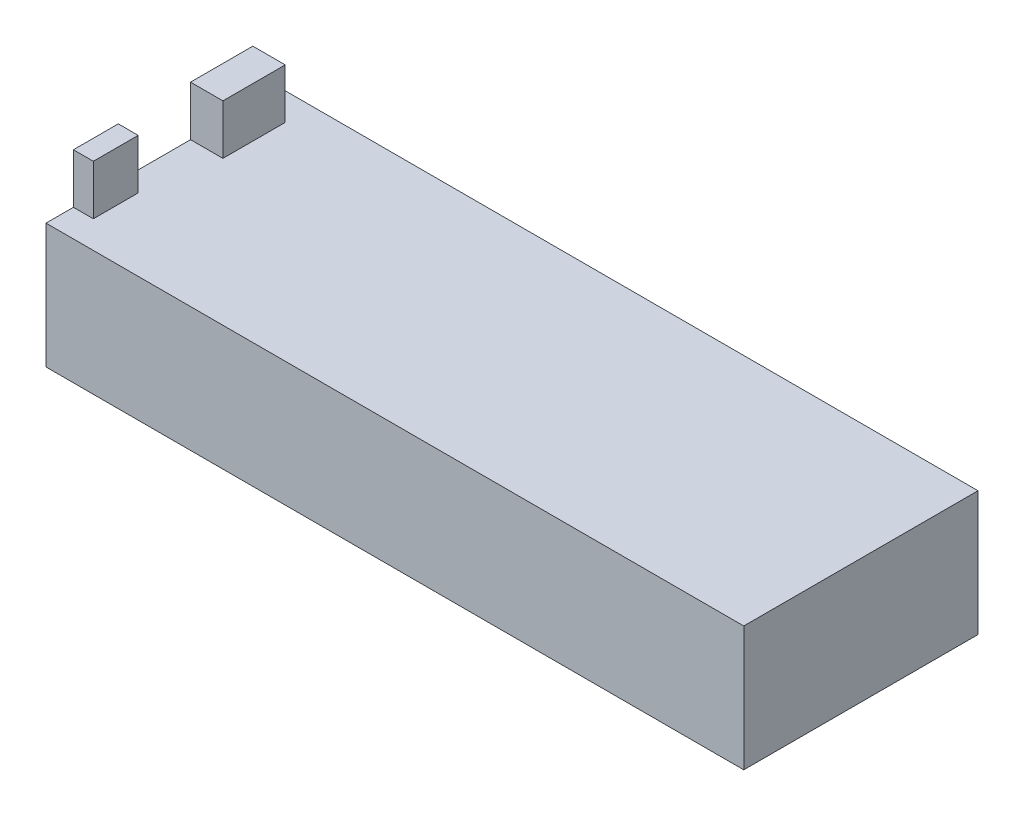
ISO-10303-21;
HEADER;
FILE_DESCRIPTION(('STEP AP214'),'2;1');
FILE_NAME('part.step','',(''),(''),'','','');
FILE_SCHEMA(('AUTOMOTIVE_DESIGN { 1 0 10303 214 1 1 1 1 }'));
ENDSEC;
DATA;
#1=APPLICATION_CONTEXT('core data for automotive mechanical design processes');
#2=APPLICATION_PROTOCOL_DEFINITION('international standard','automotive_design',2000,#1);
#3=PRODUCT_CONTEXT('',#1,'mechanical');
#4=PRODUCT('Part','Part','',(#3));
#5=PRODUCT_RELATED_PRODUCT_CATEGORY('part','',(#4));
#6=PRODUCT_DEFINITION_FORMATION('','',#4);
#7=PRODUCT_DEFINITION_CONTEXT('part definition',#1,'design');
#8=PRODUCT_DEFINITION('design','',#6,#7);
#9=PRODUCT_DEFINITION_SHAPE('','',#8);
#10=(LENGTH_UNIT() NAMED_UNIT(*) SI_UNIT(.MILLI.,.METRE.));
#11=(NAMED_UNIT(*) PLANE_ANGLE_UNIT() SI_UNIT($,.RADIAN.));
#12=(NAMED_UNIT(*) SI_UNIT($,.STERADIAN.) SOLID_ANGLE_UNIT());
#13=UNCERTAINTY_MEASURE_WITH_UNIT(LENGTH_MEASURE(1.E-05),#10,'distance_accuracy_value','');
#14=(GEOMETRIC_REPRESENTATION_CONTEXT(3) GLOBAL_UNCERTAINTY_ASSIGNED_CONTEXT((#13)) GLOBAL_UNIT_ASSIGNED_CONTEXT((#10,
#11,#12)) REPRESENTATION_CONTEXT('',''));
#15=CARTESIAN_POINT('',(0.,0.,0.));
#16=DIRECTION('',(0.,0.,1.));
#17=DIRECTION('',(1.,0.,0.));
#18=AXIS2_PLACEMENT_3D('',#15,#16,#17);
#19=CARTESIAN_POINT('',(0.,25.,0.));
#20=DIRECTION('',(0.,-1.,0.));
#21=DIRECTION('',(0.,0.,-1.));
#22=AXIS2_PLACEMENT_3D('',#19,#20,#21);
#23=PLANE('',#22);
#24=DIRECTION('',(1.,0.,0.));
#25=VECTOR('',#24,1.);
#26=CARTESIAN_POINT('',(-70.,25.,18.));
#27=LINE('',#26,#25);
#28=CARTESIAN_POINT('',(-70.,25.,18.));
#29=VERTEX_POINT('',#28);
#30=CARTESIAN_POINT('',(-66.,25.,18.));
#31=VERTEX_POINT('',#30);
#32=EDGE_CURVE('E252',#29,#31,#27,.T.);
#33=ORIENTED_EDGE('',*,*,#32,.F.);
#34=DIRECTION('',(0.,0.,1.));
#35=VECTOR('',#34,1.);
#36=CARTESIAN_POINT('',(-70.,25.,23.5));
#37=LINE('',#36,#35);
#38=CARTESIAN_POINT('',(-70.,25.,23.5));
#39=VERTEX_POINT('',#38);
#40=EDGE_CURVE('E152',#29,#39,#37,.T.);
#41=ORIENTED_EDGE('',*,*,#40,.T.);
#42=DIRECTION('',(1.,0.,0.));
#43=VECTOR('',#42,1.);
#44=CARTESIAN_POINT('',(-70.,25.,23.5));
#45=LINE('',#44,#43);
#46=CARTESIAN_POINT('',(70.,25.,23.5));
#47=VERTEX_POINT('',#46);
#48=EDGE_CURVE('E213',#39,#47,#45,.T.);
#49=ORIENTED_EDGE('',*,*,#48,.T.);
#50=DIRECTION('',(0.,0.,-1.));
#51=VECTOR('',#50,1.);
#52=CARTESIAN_POINT('',(70.,25.,23.5));
#53=LINE('',#52,#51);
#54=CARTESIAN_POINT('',(70.,25.,-23.5));
#55=VERTEX_POINT('',#54);
#56=EDGE_CURVE('E202',#47,#55,#53,.T.);
#57=ORIENTED_EDGE('',*,*,#56,.T.);
#58=DIRECTION('',(-1.,0.,0.));
#59=VECTOR('',#58,1.);
#60=CARTESIAN_POINT('',(-70.,25.,-23.5));
#61=LINE('',#60,#59);
#62=CARTESIAN_POINT('',(-70.,25.,-23.5));
#63=VERTEX_POINT('',#62);
#64=EDGE_CURVE('E206',#55,#63,#61,.T.);
#65=ORIENTED_EDGE('',*,*,#64,.T.);
#66=CARTESIAN_POINT('',(-70.,25.,-18.));
#67=VERTEX_POINT('',#66);
#68=EDGE_CURVE('E210',#63,#67,#37,.T.);
#69=ORIENTED_EDGE('',*,*,#68,.T.);
#70=DIRECTION('',(-1.,0.,0.));
#71=VECTOR('',#70,1.);
#72=CARTESIAN_POINT('',(-70.,25.,-18.));
#73=LINE('',#72,#71);
#74=CARTESIAN_POINT('',(-63.5,25.,-18.));
#75=VERTEX_POINT('',#74);
#76=EDGE_CURVE('E170',#75,#67,#73,.T.);
#77=ORIENTED_EDGE('',*,*,#76,.F.);
#78=DIRECTION('',(0.,0.,-1.));
#79=VECTOR('',#78,1.);
#80=CARTESIAN_POINT('',(-63.5,25.,-18.));
#81=LINE('',#80,#79);
#82=CARTESIAN_POINT('',(-63.5,25.,-5.5));
#83=VERTEX_POINT('',#82);
#84=EDGE_CURVE('E159',#83,#75,#81,.T.);
#85=ORIENTED_EDGE('',*,*,#84,.F.);
#86=DIRECTION('',(1.,0.,0.));
#87=VECTOR('',#86,1.);
#88=CARTESIAN_POINT('',(-70.,25.,-5.5));
#89=LINE('',#88,#87);
#90=CARTESIAN_POINT('',(-70.,25.,-5.5));
#91=VERTEX_POINT('',#90);
#92=EDGE_CURVE('E154',#91,#83,#89,.T.);
#93=ORIENTED_EDGE('',*,*,#92,.F.);
#94=CARTESIAN_POINT('',(-70.,25.,9.));
#95=VERTEX_POINT('',#94);
#96=EDGE_CURVE('E214',#91,#95,#37,.T.);
#97=ORIENTED_EDGE('',*,*,#96,.T.);
#98=DIRECTION('',(-1.,0.,0.));
#99=VECTOR('',#98,1.);
#100=CARTESIAN_POINT('',(-70.,25.,9.));
#101=LINE('',#100,#99);
#102=CARTESIAN_POINT('',(-66.,25.,9.));
#103=VERTEX_POINT('',#102);
#104=EDGE_CURVE('E60',#103,#95,#101,.T.);
#105=ORIENTED_EDGE('',*,*,#104,.F.);
#106=DIRECTION('',(0.,0.,-1.));
#107=VECTOR('',#106,1.);
#108=CARTESIAN_POINT('',(-66.,25.,9.));
#109=LINE('',#108,#107);
#110=EDGE_CURVE('E55',#31,#103,#109,.T.);
#111=ORIENTED_EDGE('',*,*,#110,.F.);
#112=EDGE_LOOP('',(#33,#41,#49,#57,#65,#69,#77,#85,#93,#97,#105,#111));
#113=FACE_BOUND('',#112,.T.);
#114=ADVANCED_FACE('F39',(#113),#23,.F.);
#115=CARTESIAN_POINT('',(70.,25.,23.5));
#116=DIRECTION('',(-1.,0.,0.));
#117=DIRECTION('',(0.,0.,1.));
#118=AXIS2_PLACEMENT_3D('',#115,#116,#117);
#119=PLANE('',#118);
#120=DIRECTION('',(0.,0.,-1.));
#121=VECTOR('',#120,1.);
#122=CARTESIAN_POINT('',(70.,0.,23.5));
#123=LINE('',#122,#121);
#124=CARTESIAN_POINT('',(70.,0.,23.5));
#125=VERTEX_POINT('',#124);
#126=CARTESIAN_POINT('',(70.,0.,-23.5));
#127=VERTEX_POINT('',#126);
#128=EDGE_CURVE('E201',#125,#127,#123,.T.);
#129=ORIENTED_EDGE('',*,*,#128,.T.);
#130=DIRECTION('',(0.,-1.,0.));
#131=VECTOR('',#130,1.);
#132=CARTESIAN_POINT('',(70.,25.,-23.5));
#133=LINE('',#132,#131);
#134=EDGE_CURVE('E11',#55,#127,#133,.T.);
#135=ORIENTED_EDGE('',*,*,#134,.F.);
#136=ORIENTED_EDGE('',*,*,#56,.F.);
#137=DIRECTION('',(0.,-1.,0.));
#138=VECTOR('',#137,1.);
#139=CARTESIAN_POINT('',(70.,25.,23.5));
#140=LINE('',#139,#138);
#141=EDGE_CURVE('E217',#47,#125,#140,.T.);
#142=ORIENTED_EDGE('',*,*,#141,.T.);
#143=EDGE_LOOP('',(#129,#135,#136,#142));
#144=FACE_BOUND('',#143,.T.);
#145=ADVANCED_FACE('F41',(#144),#119,.F.);
#146=CARTESIAN_POINT('',(-70.,25.,-23.5));
#147=DIRECTION('',(0.,0.,1.));
#148=DIRECTION('',(1.,0.,0.));
#149=AXIS2_PLACEMENT_3D('',#146,#147,#148);
#150=PLANE('',#149);
#151=DIRECTION('',(-1.,0.,0.));
#152=VECTOR('',#151,1.);
#153=CARTESIAN_POINT('',(-70.,0.,-23.5));
#154=LINE('',#153,#152);
#155=CARTESIAN_POINT('',(-70.,0.,-23.5));
#156=VERTEX_POINT('',#155);
#157=EDGE_CURVE('E221',#127,#156,#154,.T.);
#158=ORIENTED_EDGE('',*,*,#157,.T.);
#159=DIRECTION('',(0.,-1.,0.));
#160=VECTOR('',#159,1.);
#161=CARTESIAN_POINT('',(-70.,25.,-23.5));
#162=LINE('',#161,#160);
#163=EDGE_CURVE('E48',#63,#156,#162,.T.);
#164=ORIENTED_EDGE('',*,*,#163,.F.);
#165=ORIENTED_EDGE('',*,*,#64,.F.);
#166=ORIENTED_EDGE('',*,*,#134,.T.);
#167=EDGE_LOOP('',(#158,#164,#165,#166));
#168=FACE_BOUND('',#167,.T.);
#169=ADVANCED_FACE('F291',(#168),#150,.F.);
#170=CARTESIAN_POINT('',(-70.,25.,23.5));
#171=DIRECTION('',(1.,0.,0.));
#172=DIRECTION('',(0.,0.,-1.));
#173=AXIS2_PLACEMENT_3D('',#170,#171,#172);
#174=PLANE('',#173);
#175=DIRECTION('',(0.,0.,1.));
#176=VECTOR('',#175,1.);
#177=CARTESIAN_POINT('',(-70.,0.,23.5));
#178=LINE('',#177,#176);
#179=CARTESIAN_POINT('',(-70.,0.,23.5));
#180=VERTEX_POINT('',#179);
#181=EDGE_CURVE('E224',#156,#180,#178,.T.);
#182=ORIENTED_EDGE('',*,*,#181,.T.);
#183=DIRECTION('',(0.,-1.,0.));
#184=VECTOR('',#183,1.);
#185=CARTESIAN_POINT('',(-70.,25.,23.5));
#186=LINE('',#185,#184);
#187=EDGE_CURVE('E232',#39,#180,#186,.T.);
#188=ORIENTED_EDGE('',*,*,#187,.F.);
#189=ORIENTED_EDGE('',*,*,#40,.F.);
#190=DIRECTION('',(0.,-1.,0.));
#191=VECTOR('',#190,1.);
#192=CARTESIAN_POINT('',(-70.,35.,18.));
#193=LINE('',#192,#191);
#194=CARTESIAN_POINT('',(-70.,35.,18.));
#195=VERTEX_POINT('',#194);
#196=EDGE_CURVE('E132',#195,#29,#193,.T.);
#197=ORIENTED_EDGE('',*,*,#196,.F.);
#198=DIRECTION('',(0.,0.,1.));
#199=VECTOR('',#198,1.);
#200=CARTESIAN_POINT('',(-70.,35.,9.));
#201=LINE('',#200,#199);
#202=CARTESIAN_POINT('',(-70.,35.,9.));
#203=VERTEX_POINT('',#202);
#204=EDGE_CURVE('E139',#203,#195,#201,.T.);
#205=ORIENTED_EDGE('',*,*,#204,.F.);
#206=DIRECTION('',(0.,-1.,0.));
#207=VECTOR('',#206,1.);
#208=CARTESIAN_POINT('',(-70.,35.,9.));
#209=LINE('',#208,#207);
#210=EDGE_CURVE('E260',#203,#95,#209,.T.);
#211=ORIENTED_EDGE('',*,*,#210,.T.);
#212=ORIENTED_EDGE('',*,*,#96,.F.);
#213=DIRECTION('',(0.,-1.,0.));
#214=VECTOR('',#213,1.);
#215=CARTESIAN_POINT('',(-70.,35.,-5.5));
#216=LINE('',#215,#214);
#217=CARTESIAN_POINT('',(-70.,35.,-5.5));
#218=VERTEX_POINT('',#217);
#219=EDGE_CURVE('E197',#218,#91,#216,.T.);
#220=ORIENTED_EDGE('',*,*,#219,.F.);
#221=DIRECTION('',(0.,0.,1.));
#222=VECTOR('',#221,1.);
#223=CARTESIAN_POINT('',(-70.,35.,-18.));
#224=LINE('',#223,#222);
#225=CARTESIAN_POINT('',(-70.,35.,-18.));
#226=VERTEX_POINT('',#225);
#227=EDGE_CURVE('E165',#226,#218,#224,.T.);
#228=ORIENTED_EDGE('',*,*,#227,.F.);
#229=DIRECTION('',(0.,-1.,0.));
#230=VECTOR('',#229,1.);
#231=CARTESIAN_POINT('',(-70.,35.,-18.));
#232=LINE('',#231,#230);
#233=EDGE_CURVE('E178',#226,#67,#232,.T.);
#234=ORIENTED_EDGE('',*,*,#233,.T.);
#235=ORIENTED_EDGE('',*,*,#68,.F.);
#236=ORIENTED_EDGE('',*,*,#163,.T.);
#237=EDGE_LOOP('',(#182,#188,#189,#197,#205,#211,#212,#220,#228,#234,#235,#236));
#238=FACE_BOUND('',#237,.T.);
#239=ADVANCED_FACE('F150',(#238),#174,.F.);
#240=CARTESIAN_POINT('',(-70.,25.,23.5));
#241=DIRECTION('',(0.,0.,-1.));
#242=DIRECTION('',(-1.,0.,0.));
#243=AXIS2_PLACEMENT_3D('',#240,#241,#242);
#244=PLANE('',#243);
#245=DIRECTION('',(1.,0.,0.));
#246=VECTOR('',#245,1.);
#247=CARTESIAN_POINT('',(-70.,0.,23.5));
#248=LINE('',#247,#246);
#249=EDGE_CURVE('E207',#180,#125,#248,.T.);
#250=ORIENTED_EDGE('',*,*,#249,.T.);
#251=ORIENTED_EDGE('',*,*,#141,.F.);
#252=ORIENTED_EDGE('',*,*,#48,.F.);
#253=ORIENTED_EDGE('',*,*,#187,.T.);
#254=EDGE_LOOP('',(#250,#251,#252,#253));
#255=FACE_BOUND('',#254,.T.);
#256=ADVANCED_FACE('F247',(#255),#244,.F.);
#257=CARTESIAN_POINT('',(0.,0.,0.));
#258=DIRECTION('',(0.,-1.,0.));
#259=DIRECTION('',(0.,0.,-1.));
#260=AXIS2_PLACEMENT_3D('',#257,#258,#259);
#261=PLANE('',#260);
#262=ORIENTED_EDGE('',*,*,#128,.F.);
#263=ORIENTED_EDGE('',*,*,#249,.F.);
#264=ORIENTED_EDGE('',*,*,#181,.F.);
#265=ORIENTED_EDGE('',*,*,#157,.F.);
#266=EDGE_LOOP('',(#262,#263,#264,#265));
#267=FACE_BOUND('',#266,.T.);
#268=ADVANCED_FACE('F244',(#267),#261,.T.);
#269=CARTESIAN_POINT('',(-70.,35.,-5.5));
#270=DIRECTION('',(0.,0.,-1.));
#271=DIRECTION('',(-1.,0.,0.));
#272=AXIS2_PLACEMENT_3D('',#269,#270,#271);
#273=PLANE('',#272);
#274=ORIENTED_EDGE('',*,*,#92,.T.);
#275=DIRECTION('',(0.,-1.,0.));
#276=VECTOR('',#275,1.);
#277=CARTESIAN_POINT('',(-63.5,35.,-5.5));
#278=LINE('',#277,#276);
#279=CARTESIAN_POINT('',(-63.5,35.,-5.5));
#280=VERTEX_POINT('',#279);
#281=EDGE_CURVE('E193',#280,#83,#278,.T.);
#282=ORIENTED_EDGE('',*,*,#281,.F.);
#283=DIRECTION('',(1.,0.,0.));
#284=VECTOR('',#283,1.);
#285=CARTESIAN_POINT('',(-70.,35.,-5.5));
#286=LINE('',#285,#284);
#287=EDGE_CURVE('E169',#218,#280,#286,.T.);
#288=ORIENTED_EDGE('',*,*,#287,.F.);
#289=ORIENTED_EDGE('',*,*,#219,.T.);
#290=EDGE_LOOP('',(#274,#282,#288,#289));
#291=FACE_BOUND('',#290,.T.);
#292=ADVANCED_FACE('F294',(#291),#273,.F.);
#293=CARTESIAN_POINT('',(-63.5,35.,-18.));
#294=DIRECTION('',(-1.,0.,0.));
#295=DIRECTION('',(0.,0.,1.));
#296=AXIS2_PLACEMENT_3D('',#293,#294,#295);
#297=PLANE('',#296);
#298=ORIENTED_EDGE('',*,*,#84,.T.);
#299=DIRECTION('',(0.,-1.,0.));
#300=VECTOR('',#299,1.);
#301=CARTESIAN_POINT('',(-63.5,35.,-18.));
#302=LINE('',#301,#300);
#303=CARTESIAN_POINT('',(-63.5,35.,-18.));
#304=VERTEX_POINT('',#303);
#305=EDGE_CURVE('E189',#304,#75,#302,.T.);
#306=ORIENTED_EDGE('',*,*,#305,.F.);
#307=DIRECTION('',(0.,0.,-1.));
#308=VECTOR('',#307,1.);
#309=CARTESIAN_POINT('',(-63.5,35.,-18.));
#310=LINE('',#309,#308);
#311=EDGE_CURVE('E173',#280,#304,#310,.T.);
#312=ORIENTED_EDGE('',*,*,#311,.F.);
#313=ORIENTED_EDGE('',*,*,#281,.T.);
#314=EDGE_LOOP('',(#298,#306,#312,#313));
#315=FACE_BOUND('',#314,.T.);
#316=ADVANCED_FACE('F324',(#315),#297,.F.);
#317=CARTESIAN_POINT('',(-70.,35.,-18.));
#318=DIRECTION('',(0.,0.,1.));
#319=DIRECTION('',(1.,0.,0.));
#320=AXIS2_PLACEMENT_3D('',#317,#318,#319);
#321=PLANE('',#320);
#322=ORIENTED_EDGE('',*,*,#76,.T.);
#323=ORIENTED_EDGE('',*,*,#233,.F.);
#324=DIRECTION('',(-1.,0.,0.));
#325=VECTOR('',#324,1.);
#326=CARTESIAN_POINT('',(-70.,35.,-18.));
#327=LINE('',#326,#325);
#328=EDGE_CURVE('E176',#304,#226,#327,.T.);
#329=ORIENTED_EDGE('',*,*,#328,.F.);
#330=ORIENTED_EDGE('',*,*,#305,.T.);
#331=EDGE_LOOP('',(#322,#323,#329,#330));
#332=FACE_BOUND('',#331,.T.);
#333=ADVANCED_FACE('F331',(#332),#321,.F.);
#334=CARTESIAN_POINT('',(0.,35.,0.));
#335=DIRECTION('',(0.,1.,0.));
#336=DIRECTION('',(0.,0.,1.));
#337=AXIS2_PLACEMENT_3D('',#334,#335,#336);
#338=PLANE('',#337);
#339=ORIENTED_EDGE('',*,*,#227,.T.);
#340=ORIENTED_EDGE('',*,*,#287,.T.);
#341=ORIENTED_EDGE('',*,*,#311,.T.);
#342=ORIENTED_EDGE('',*,*,#328,.T.);
#343=EDGE_LOOP('',(#339,#340,#341,#342));
#344=FACE_BOUND('',#343,.T.);
#345=ADVANCED_FACE('F284',(#344),#338,.T.);
#346=CARTESIAN_POINT('',(-70.,35.,18.));
#347=DIRECTION('',(0.,0.,-1.));
#348=DIRECTION('',(-1.,0.,0.));
#349=AXIS2_PLACEMENT_3D('',#346,#347,#348);
#350=PLANE('',#349);
#351=ORIENTED_EDGE('',*,*,#32,.T.);
#352=DIRECTION('',(0.,-1.,0.));
#353=VECTOR('',#352,1.);
#354=CARTESIAN_POINT('',(-66.,35.,18.));
#355=LINE('',#354,#353);
#356=CARTESIAN_POINT('',(-66.,35.,18.));
#357=VERTEX_POINT('',#356);
#358=EDGE_CURVE('E134',#357,#31,#355,.T.);
#359=ORIENTED_EDGE('',*,*,#358,.F.);
#360=DIRECTION('',(1.,0.,0.));
#361=VECTOR('',#360,1.);
#362=CARTESIAN_POINT('',(-70.,35.,18.));
#363=LINE('',#362,#361);
#364=EDGE_CURVE('E128',#195,#357,#363,.T.);
#365=ORIENTED_EDGE('',*,*,#364,.F.);
#366=ORIENTED_EDGE('',*,*,#196,.T.);
#367=EDGE_LOOP('',(#351,#359,#365,#366));
#368=FACE_BOUND('',#367,.T.);
#369=ADVANCED_FACE('F130',(#368),#350,.F.);
#370=CARTESIAN_POINT('',(-66.,35.,9.));
#371=DIRECTION('',(-1.,0.,0.));
#372=DIRECTION('',(0.,0.,1.));
#373=AXIS2_PLACEMENT_3D('',#370,#371,#372);
#374=PLANE('',#373);
#375=ORIENTED_EDGE('',*,*,#110,.T.);
#376=DIRECTION('',(0.,-1.,0.));
#377=VECTOR('',#376,1.);
#378=CARTESIAN_POINT('',(-66.,35.,9.));
#379=LINE('',#378,#377);
#380=CARTESIAN_POINT('',(-66.,35.,9.));
#381=VERTEX_POINT('',#380);
#382=EDGE_CURVE('E161',#381,#103,#379,.T.);
#383=ORIENTED_EDGE('',*,*,#382,.F.);
#384=DIRECTION('',(0.,0.,-1.));
#385=VECTOR('',#384,1.);
#386=CARTESIAN_POINT('',(-66.,35.,9.));
#387=LINE('',#386,#385);
#388=EDGE_CURVE('E138',#357,#381,#387,.T.);
#389=ORIENTED_EDGE('',*,*,#388,.F.);
#390=ORIENTED_EDGE('',*,*,#358,.T.);
#391=EDGE_LOOP('',(#375,#383,#389,#390));
#392=FACE_BOUND('',#391,.T.);
#393=ADVANCED_FACE('F276',(#392),#374,.F.);
#394=CARTESIAN_POINT('',(-70.,35.,9.));
#395=DIRECTION('',(0.,0.,1.));
#396=DIRECTION('',(1.,0.,0.));
#397=AXIS2_PLACEMENT_3D('',#394,#395,#396);
#398=PLANE('',#397);
#399=ORIENTED_EDGE('',*,*,#104,.T.);
#400=ORIENTED_EDGE('',*,*,#210,.F.);
#401=DIRECTION('',(-1.,0.,0.));
#402=VECTOR('',#401,1.);
#403=CARTESIAN_POINT('',(-70.,35.,9.));
#404=LINE('',#403,#402);
#405=EDGE_CURVE('E144',#381,#203,#404,.T.);
#406=ORIENTED_EDGE('',*,*,#405,.F.);
#407=ORIENTED_EDGE('',*,*,#382,.T.);
#408=EDGE_LOOP('',(#399,#400,#406,#407));
#409=FACE_BOUND('',#408,.T.);
#410=ADVANCED_FACE('F259',(#409),#398,.F.);
#411=CARTESIAN_POINT('',(0.,35.,0.));
#412=DIRECTION('',(0.,1.,0.));
#413=DIRECTION('',(0.,0.,1.));
#414=AXIS2_PLACEMENT_3D('',#411,#412,#413);
#415=PLANE('',#414);
#416=ORIENTED_EDGE('',*,*,#204,.T.);
#417=ORIENTED_EDGE('',*,*,#364,.T.);
#418=ORIENTED_EDGE('',*,*,#388,.T.);
#419=ORIENTED_EDGE('',*,*,#405,.T.);
#420=EDGE_LOOP('',(#416,#417,#418,#419));
#421=FACE_BOUND('',#420,.T.);
#422=ADVANCED_FACE('F142',(#421),#415,.T.);
#423=CLOSED_SHELL('',(#114,#145,#169,#239,#256,#268,#292,#316,#333,#345,#369,#393,#410,#422));
#424=MANIFOLD_SOLID_BREP('B2',#423);
#425=ADVANCED_BREP_SHAPE_REPRESENTATION('',(#18,#424),#14);
#426=SHAPE_DEFINITION_REPRESENTATION(#9,#425);
ENDSEC;
END-ISO-10303-21;
